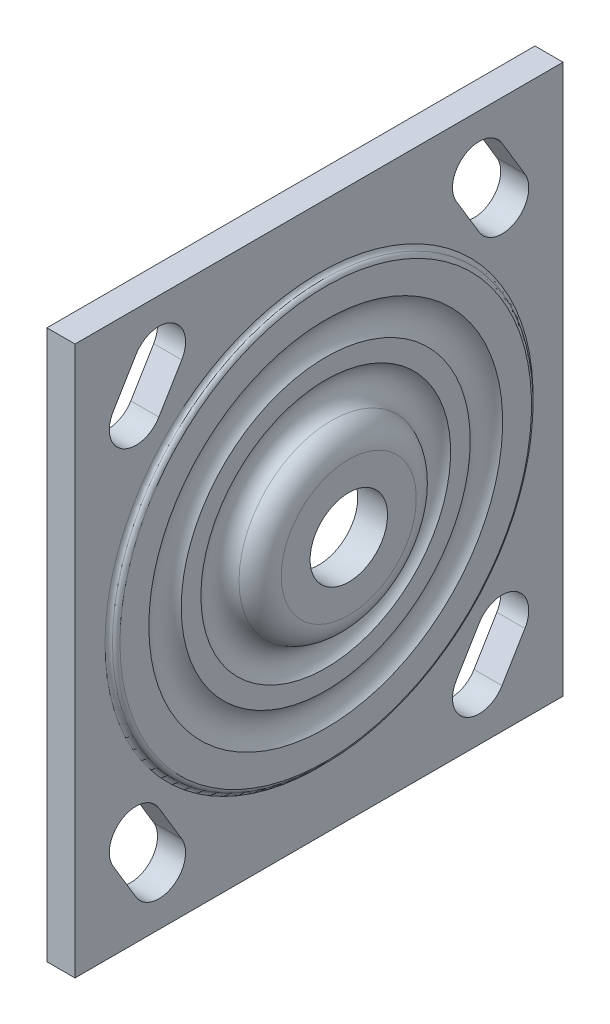
ISO-10303-21;
HEADER;
FILE_DESCRIPTION(('STEP AP214'),'2;1');
FILE_NAME('part.step','',(''),(''),'','','');
FILE_SCHEMA(('AUTOMOTIVE_DESIGN { 1 0 10303 214 1 1 1 1 }'));
ENDSEC;
DATA;
#1=APPLICATION_CONTEXT('core data for automotive mechanical design processes');
#2=APPLICATION_PROTOCOL_DEFINITION('international standard','automotive_design',2000,#1);
#3=PRODUCT_CONTEXT('',#1,'mechanical');
#4=PRODUCT('Part','Part','',(#3));
#5=PRODUCT_RELATED_PRODUCT_CATEGORY('part','',(#4));
#6=PRODUCT_DEFINITION_FORMATION('','',#4);
#7=PRODUCT_DEFINITION_CONTEXT('part definition',#1,'design');
#8=PRODUCT_DEFINITION('design','',#6,#7);
#9=PRODUCT_DEFINITION_SHAPE('','',#8);
#10=(LENGTH_UNIT() NAMED_UNIT(*) SI_UNIT(.MILLI.,.METRE.));
#11=(NAMED_UNIT(*) PLANE_ANGLE_UNIT() SI_UNIT($,.RADIAN.));
#12=(NAMED_UNIT(*) SI_UNIT($,.STERADIAN.) SOLID_ANGLE_UNIT());
#13=UNCERTAINTY_MEASURE_WITH_UNIT(LENGTH_MEASURE(1.E-05),#10,'distance_accuracy_value','');
#14=(GEOMETRIC_REPRESENTATION_CONTEXT(3) GLOBAL_UNCERTAINTY_ASSIGNED_CONTEXT((#13)) GLOBAL_UNIT_ASSIGNED_CONTEXT((#10,
#11,#12)) REPRESENTATION_CONTEXT('',''));
#15=CARTESIAN_POINT('',(0.,0.,0.));
#16=DIRECTION('',(0.,0.,1.));
#17=DIRECTION('',(1.,0.,0.));
#18=AXIS2_PLACEMENT_3D('',#15,#16,#17);
#19=CARTESIAN_POINT('',(-9.34719999999996,0.,0.));
#20=DIRECTION('',(-1.,0.,0.));
#21=DIRECTION('',(0.,0.,1.));
#22=AXIS2_PLACEMENT_3D('',#19,#20,#21);
#23=TOROIDAL_SURFACE('',#22,40.41507152324,4.77520000000001);
#24=CARTESIAN_POINT('',(-5.84199999999992,0.,0.));
#25=DIRECTION('',(-1.,0.,0.));
#26=DIRECTION('',(0.,0.,1.));
#27=AXIS2_PLACEMENT_3D('',#24,#25,#26);
#28=CIRCLE('',#27,37.1722166081999);
#29=CARTESIAN_POINT('',(-5.84199999999992,0.,37.1722166081999));
#30=VERTEX_POINT('',#29);
#31=EDGE_CURVE('E345',#30,#30,#28,.T.);
#32=ORIENTED_EDGE('',*,*,#31,.F.);
#33=EDGE_LOOP('',(#32));
#34=FACE_BOUND('',#33,.T.);
#35=CARTESIAN_POINT('',(-5.84199999999991,0.,0.));
#36=DIRECTION('',(-1.,0.,0.));
#37=DIRECTION('',(0.,0.,1.));
#38=AXIS2_PLACEMENT_3D('',#35,#36,#37);
#39=CIRCLE('',#38,43.6579264382801);
#40=CARTESIAN_POINT('',(-5.84199999999991,0.,43.6579264382801));
#41=VERTEX_POINT('',#40);
#42=EDGE_CURVE('E296',#41,#41,#39,.T.);
#43=ORIENTED_EDGE('',*,*,#42,.T.);
#44=EDGE_LOOP('',(#43));
#45=FACE_BOUND('',#44,.T.);
#46=ADVANCED_FACE('F17',(#34,#45),#23,.F.);
#47=CARTESIAN_POINT('',(-5.84199999999992,37.1722166081999,0.));
#48=DIRECTION('',(1.,0.,0.));
#49=DIRECTION('',(0.,0.,-1.));
#50=AXIS2_PLACEMENT_3D('',#47,#48,#49);
#51=PLANE('',#50);
#52=CARTESIAN_POINT('',(-5.84199999999992,0.,0.));
#53=DIRECTION('',(-1.,0.,0.));
#54=DIRECTION('',(0.,0.,1.));
#55=AXIS2_PLACEMENT_3D('',#52,#53,#54);
#56=CIRCLE('',#55,30.7415299150416);
#57=CARTESIAN_POINT('',(-5.84199999999992,0.,30.7415299150416));
#58=VERTEX_POINT('',#57);
#59=EDGE_CURVE('E342',#58,#58,#56,.T.);
#60=ORIENTED_EDGE('',*,*,#59,.F.);
#61=EDGE_LOOP('',(#60));
#62=FACE_BOUND('',#61,.T.);
#63=ORIENTED_EDGE('',*,*,#31,.T.);
#64=EDGE_LOOP('',(#63));
#65=FACE_BOUND('',#64,.T.);
#66=ADVANCED_FACE('F380',(#62,#65),#51,.F.);
#67=CARTESIAN_POINT('',(-9.34720000000001,0.,0.));
#68=DIRECTION('',(-1.,0.,0.));
#69=DIRECTION('',(0.,0.,1.));
#70=AXIS2_PLACEMENT_3D('',#67,#68,#69);
#71=TOROIDAL_SURFACE('',#70,27.4986750000015,4.77520000000003);
#72=CARTESIAN_POINT('',(-5.84200000000001,0.,0.));
#73=DIRECTION('',(-1.,0.,0.));
#74=DIRECTION('',(0.,0.,1.));
#75=AXIS2_PLACEMENT_3D('',#72,#73,#74);
#76=CIRCLE('',#75,24.2558200849613);
#77=CARTESIAN_POINT('',(-5.84200000000001,0.,24.2558200849613));
#78=VERTEX_POINT('',#77);
#79=EDGE_CURVE('E339',#78,#78,#76,.T.);
#80=ORIENTED_EDGE('',*,*,#79,.F.);
#81=EDGE_LOOP('',(#80));
#82=FACE_BOUND('',#81,.T.);
#83=ORIENTED_EDGE('',*,*,#59,.T.);
#84=EDGE_LOOP('',(#83));
#85=FACE_BOUND('',#84,.T.);
#86=ADVANCED_FACE('F386',(#82,#85),#71,.F.);
#87=CARTESIAN_POINT('',(-5.84200000000001,24.2558200849613,0.));
#88=DIRECTION('',(1.,0.,0.));
#89=DIRECTION('',(0.,0.,-1.));
#90=AXIS2_PLACEMENT_3D('',#87,#88,#89);
#91=PLANE('',#90);
#92=CARTESIAN_POINT('',(-5.84200000000001,0.,0.));
#93=DIRECTION('',(-1.,0.,0.));
#94=DIRECTION('',(0.,0.,1.));
#95=AXIS2_PLACEMENT_3D('',#92,#93,#94);
#96=CIRCLE('',#95,19.4416968589855);
#97=CARTESIAN_POINT('',(-5.84200000000001,0.,19.4416968589855));
#98=VERTEX_POINT('',#97);
#99=EDGE_CURVE('E336',#98,#98,#96,.T.);
#100=ORIENTED_EDGE('',*,*,#99,.F.);
#101=EDGE_LOOP('',(#100));
#102=FACE_BOUND('',#101,.T.);
#103=ORIENTED_EDGE('',*,*,#79,.T.);
#104=EDGE_LOOP('',(#103));
#105=FACE_BOUND('',#104,.T.);
#106=ADVANCED_FACE('F450',(#102,#105),#91,.F.);
#107=CARTESIAN_POINT('',(-0.285749999999976,0.,0.));
#108=DIRECTION('',(-1.,0.,0.));
#109=DIRECTION('',(0.,0.,1.));
#110=AXIS2_PLACEMENT_3D('',#107,#108,#109);
#111=TOROIDAL_SURFACE('',#110,19.4416968589853,5.55625000000003);
#112=CARTESIAN_POINT('',(-1.29822222222226,0.,0.));
#113=DIRECTION('',(-1.,0.,0.));
#114=DIRECTION('',(0.,0.,1.));
#115=AXIS2_PLACEMENT_3D('',#112,#113,#114);
#116=CIRCLE('',#115,13.978473079775);
#117=CARTESIAN_POINT('',(-1.29822222222226,0.,13.978473079775));
#118=VERTEX_POINT('',#117);
#119=EDGE_CURVE('E333',#118,#118,#116,.T.);
#120=ORIENTED_EDGE('',*,*,#119,.F.);
#121=EDGE_LOOP('',(#120));
#122=FACE_BOUND('',#121,.T.);
#123=ORIENTED_EDGE('',*,*,#99,.T.);
#124=EDGE_LOOP('',(#123));
#125=FACE_BOUND('',#124,.T.);
#126=ADVANCED_FACE('F446',(#122,#125),#111,.T.);
#127=CARTESIAN_POINT('',(-1.58750000000007,0.,0.));
#128=DIRECTION('',(-1.,0.,0.));
#129=DIRECTION('',(0.,0.,1.));
#130=AXIS2_PLACEMENT_3D('',#127,#128,#129);
#131=TOROIDAL_SURFACE('',#130,12.4175520000009,1.58749999999973);
#132=CARTESIAN_POINT('',(-3.40222641725951E-13,0.,0.));
#133=DIRECTION('',(-1.,0.,0.));
#134=DIRECTION('',(0.,0.,1.));
#135=AXIS2_PLACEMENT_3D('',#132,#133,#134);
#136=CIRCLE('',#135,12.417552);
#137=CARTESIAN_POINT('',(-3.40222641725951E-13,0.,12.417552));
#138=VERTEX_POINT('',#137);
#139=EDGE_CURVE('E330',#138,#138,#136,.T.);
#140=ORIENTED_EDGE('',*,*,#139,.F.);
#141=EDGE_LOOP('',(#140));
#142=FACE_BOUND('',#141,.T.);
#143=ORIENTED_EDGE('',*,*,#119,.T.);
#144=EDGE_LOOP('',(#143));
#145=FACE_BOUND('',#144,.T.);
#146=ADVANCED_FACE('F442',(#142,#145),#131,.F.);
#147=CARTESIAN_POINT('',(-3.39146535884689E-13,12.417552,0.));
#148=DIRECTION('',(1.,0.,0.));
#149=DIRECTION('',(0.,0.,-1.));
#150=AXIS2_PLACEMENT_3D('',#147,#148,#149);
#151=PLANE('',#150);
#152=CARTESIAN_POINT('',(-3.38070430043429E-13,0.,0.));
#153=DIRECTION('',(-1.,0.,0.));
#154=DIRECTION('',(0.,0.,1.));
#155=AXIS2_PLACEMENT_3D('',#152,#153,#154);
#156=CIRCLE('',#155,8.0645);
#157=CARTESIAN_POINT('',(-3.38070430043429E-13,0.,8.0645));
#158=VERTEX_POINT('',#157);
#159=EDGE_CURVE('E327',#158,#158,#156,.T.);
#160=ORIENTED_EDGE('',*,*,#159,.F.);
#161=EDGE_LOOP('',(#160));
#162=FACE_BOUND('',#161,.T.);
#163=ORIENTED_EDGE('',*,*,#139,.T.);
#164=EDGE_LOOP('',(#163));
#165=FACE_BOUND('',#164,.T.);
#166=ADVANCED_FACE('F438',(#162,#165),#151,.F.);
#167=CARTESIAN_POINT('',(6.27954986710278E-11,0.,0.));
#168=DIRECTION('',(-1.,0.,0.));
#169=DIRECTION('',(0.,0.,1.));
#170=AXIS2_PLACEMENT_3D('',#167,#168,#169);
#171=CYLINDRICAL_SURFACE('',#170,8.0645);
#172=CARTESIAN_POINT('',(6.19759999999961,0.,0.));
#173=DIRECTION('',(-1.,0.,0.));
#174=DIRECTION('',(0.,0.,1.));
#175=AXIS2_PLACEMENT_3D('',#172,#173,#174);
#176=CIRCLE('',#175,8.0645);
#177=CARTESIAN_POINT('',(6.19759999999961,0.,8.0645));
#178=VERTEX_POINT('',#177);
#179=EDGE_CURVE('E324',#178,#178,#176,.T.);
#180=ORIENTED_EDGE('',*,*,#179,.F.);
#181=EDGE_LOOP('',(#180));
#182=FACE_BOUND('',#181,.T.);
#183=ORIENTED_EDGE('',*,*,#159,.T.);
#184=EDGE_LOOP('',(#183));
#185=FACE_BOUND('',#184,.T.);
#186=ADVANCED_FACE('F434',(#182,#185),#171,.F.);
#187=CARTESIAN_POINT('',(6.19759999999961,14.0562775598835,0.));
#188=DIRECTION('',(-1.,0.,0.));
#189=DIRECTION('',(0.,0.,1.));
#190=AXIS2_PLACEMENT_3D('',#187,#188,#189);
#191=PLANE('',#190);
#192=CARTESIAN_POINT('',(6.19759999999961,0.,0.));
#193=DIRECTION('',(-1.,0.,0.));
#194=DIRECTION('',(0.,0.,1.));
#195=AXIS2_PLACEMENT_3D('',#192,#193,#194);
#196=CIRCLE('',#195,14.0562775598835);
#197=CARTESIAN_POINT('',(6.19759999999961,0.,14.0562775598835));
#198=VERTEX_POINT('',#197);
#199=EDGE_CURVE('E321',#198,#198,#196,.T.);
#200=ORIENTED_EDGE('',*,*,#199,.F.);
#201=EDGE_LOOP('',(#200));
#202=FACE_BOUND('',#201,.T.);
#203=ORIENTED_EDGE('',*,*,#179,.T.);
#204=EDGE_LOOP('',(#203));
#205=FACE_BOUND('',#204,.T.);
#206=ADVANCED_FACE('F430',(#202,#205),#191,.F.);
#207=CARTESIAN_POINT('',(0.660399999999837,0.,0.));
#208=DIRECTION('',(-1.,0.,0.));
#209=DIRECTION('',(0.,0.,1.));
#210=AXIS2_PLACEMENT_3D('',#207,#208,#209);
#211=TOROIDAL_SURFACE('',#210,14.0562775598829,5.53719999999977);
#212=CARTESIAN_POINT('',(2.58750835003288,0.,0.));
#213=DIRECTION('',(-1.,0.,0.));
#214=DIRECTION('',(0.,0.,1.));
#215=AXIS2_PLACEMENT_3D('',#212,#213,#214);
#216=CIRCLE('',#215,19.2473118737004);
#217=CARTESIAN_POINT('',(2.58750835003288,0.,19.2473118737004));
#218=VERTEX_POINT('',#217);
#219=EDGE_CURVE('E318',#218,#218,#216,.T.);
#220=ORIENTED_EDGE('',*,*,#219,.F.);
#221=EDGE_LOOP('',(#220));
#222=FACE_BOUND('',#221,.T.);
#223=ORIENTED_EDGE('',*,*,#199,.T.);
#224=EDGE_LOOP('',(#223));
#225=FACE_BOUND('',#224,.T.);
#226=ADVANCED_FACE('F426',(#222,#225),#211,.T.);
#227=CARTESIAN_POINT('',(3.96874999999949,0.,0.));
#228=DIRECTION('',(-1.,0.,0.));
#229=DIRECTION('',(0.,0.,1.));
#230=AXIS2_PLACEMENT_3D('',#227,#228,#229);
#231=TOROIDAL_SURFACE('',#230,22.9679500000031,3.96875);
#232=CARTESIAN_POINT('',(1.39699999999934,0.,0.));
#233=DIRECTION('',(-1.,0.,0.));
#234=DIRECTION('',(0.,0.,1.));
#235=AXIS2_PLACEMENT_3D('',#232,#233,#234);
#236=CIRCLE('',#235,25.9907100797976);
#237=CARTESIAN_POINT('',(1.39699999999934,0.,25.9907100797976));
#238=VERTEX_POINT('',#237);
#239=EDGE_CURVE('E315',#238,#238,#236,.T.);
#240=ORIENTED_EDGE('',*,*,#239,.F.);
#241=EDGE_LOOP('',(#240));
#242=FACE_BOUND('',#241,.T.);
#243=ORIENTED_EDGE('',*,*,#219,.T.);
#244=EDGE_LOOP('',(#243));
#245=FACE_BOUND('',#244,.T.);
#246=ADVANCED_FACE('F422',(#242,#245),#231,.F.);
#247=CARTESIAN_POINT('',(1.39699999999934,30.0768481781234,0.));
#248=DIRECTION('',(-1.,0.,0.));
#249=DIRECTION('',(0.,0.,1.));
#250=AXIS2_PLACEMENT_3D('',#247,#248,#249);
#251=PLANE('',#250);
#252=CARTESIAN_POINT('',(1.39699999999934,0.,0.));
#253=DIRECTION('',(-1.,0.,0.));
#254=DIRECTION('',(0.,0.,1.));
#255=AXIS2_PLACEMENT_3D('',#252,#253,#254);
#256=CIRCLE('',#255,30.0768481781234);
#257=CARTESIAN_POINT('',(1.39699999999934,0.,30.0768481781234));
#258=VERTEX_POINT('',#257);
#259=EDGE_CURVE('E312',#258,#258,#256,.T.);
#260=ORIENTED_EDGE('',*,*,#259,.F.);
#261=EDGE_LOOP('',(#260));
#262=FACE_BOUND('',#261,.T.);
#263=ORIENTED_EDGE('',*,*,#239,.T.);
#264=EDGE_LOOP('',(#263));
#265=FACE_BOUND('',#264,.T.);
#266=ADVANCED_FACE('F418',(#262,#265),#251,.F.);
#267=CARTESIAN_POINT('',(4.7751999999997,0.,0.));
#268=DIRECTION('',(-1.,0.,0.));
#269=DIRECTION('',(0.,0.,1.));
#270=AXIS2_PLACEMENT_3D('',#267,#268,#269);
#271=TOROIDAL_SURFACE('',#270,33.4518000000013,4.77519999999998);
#272=CARTESIAN_POINT('',(1.39700000000004,0.,0.));
#273=DIRECTION('',(-1.,0.,0.));
#274=DIRECTION('',(0.,0.,1.));
#275=AXIS2_PLACEMENT_3D('',#272,#273,#274);
#276=CIRCLE('',#275,36.82675182188);
#277=CARTESIAN_POINT('',(1.39700000000004,0.,36.82675182188));
#278=VERTEX_POINT('',#277);
#279=EDGE_CURVE('E309',#278,#278,#276,.T.);
#280=ORIENTED_EDGE('',*,*,#279,.F.);
#281=EDGE_LOOP('',(#280));
#282=FACE_BOUND('',#281,.T.);
#283=ORIENTED_EDGE('',*,*,#259,.T.);
#284=EDGE_LOOP('',(#283));
#285=FACE_BOUND('',#284,.T.);
#286=ADVANCED_FACE('F414',(#282,#285),#271,.F.);
#287=CARTESIAN_POINT('',(1.39700000000004,42.8341143452214,0.));
#288=DIRECTION('',(-1.,0.,0.));
#289=DIRECTION('',(0.,0.,1.));
#290=AXIS2_PLACEMENT_3D('',#287,#288,#289);
#291=PLANE('',#290);
#292=CARTESIAN_POINT('',(1.39700000000004,0.,0.));
#293=DIRECTION('',(-1.,0.,0.));
#294=DIRECTION('',(0.,0.,1.));
#295=AXIS2_PLACEMENT_3D('',#292,#293,#294);
#296=CIRCLE('',#295,42.8341143452214);
#297=CARTESIAN_POINT('',(1.39700000000004,0.,42.8341143452214));
#298=VERTEX_POINT('',#297);
#299=EDGE_CURVE('E306',#298,#298,#296,.T.);
#300=ORIENTED_EDGE('',*,*,#299,.F.);
#301=EDGE_LOOP('',(#300));
#302=FACE_BOUND('',#301,.T.);
#303=ORIENTED_EDGE('',*,*,#279,.T.);
#304=EDGE_LOOP('',(#303));
#305=FACE_BOUND('',#304,.T.);
#306=ADVANCED_FACE('F410',(#302,#305),#291,.F.);
#307=CARTESIAN_POINT('',(0.298557634848601,0.,0.));
#308=DIRECTION('',(-1.,0.,0.));
#309=DIRECTION('',(0.,0.,1.));
#310=AXIS2_PLACEMENT_3D('',#307,#308,#309);
#311=TOROIDAL_SURFACE('',#310,42.661742014373,1.11188481867575);
#312=CARTESIAN_POINT('',(0.698499999999996,0.,0.));
#313=DIRECTION('',(-1.,0.,0.));
#314=DIRECTION('',(0.,0.,1.));
#315=AXIS2_PLACEMENT_3D('',#312,#313,#314);
#316=CIRCLE('',#315,43.6992071726115);
#317=CARTESIAN_POINT('',(0.698499999999996,0.,43.6992071726115));
#318=VERTEX_POINT('',#317);
#319=EDGE_CURVE('E303',#318,#318,#316,.T.);
#320=ORIENTED_EDGE('',*,*,#319,.F.);
#321=EDGE_LOOP('',(#320));
#322=FACE_BOUND('',#321,.T.);
#323=ORIENTED_EDGE('',*,*,#299,.T.);
#324=EDGE_LOOP('',(#323));
#325=FACE_BOUND('',#324,.T.);
#326=ADVANCED_FACE('F406',(#322,#325),#311,.T.);
#327=CARTESIAN_POINT('',(1.0984423651515,0.,0.));
#328=DIRECTION('',(-1.,0.,0.));
#329=DIRECTION('',(0.,0.,1.));
#330=AXIS2_PLACEMENT_3D('',#327,#328,#329);
#331=TOROIDAL_SURFACE('',#330,44.7366723308499,1.11188481867575);
#332=CARTESIAN_POINT('',(0.,0.,0.));
#333=DIRECTION('',(-1.,0.,0.));
#334=DIRECTION('',(0.,0.,1.));
#335=AXIS2_PLACEMENT_3D('',#332,#333,#334);
#336=CIRCLE('',#335,44.5643000000015);
#337=CARTESIAN_POINT('',(0.,0.,44.5643000000015));
#338=VERTEX_POINT('',#337);
#339=EDGE_CURVE('E300',#338,#338,#336,.T.);
#340=ORIENTED_EDGE('',*,*,#339,.F.);
#341=EDGE_LOOP('',(#340));
#342=FACE_BOUND('',#341,.T.);
#343=ORIENTED_EDGE('',*,*,#319,.T.);
#344=EDGE_LOOP('',(#343));
#345=FACE_BOUND('',#344,.T.);
#346=ADVANCED_FACE('F400',(#342,#345),#331,.F.);
#347=CARTESIAN_POINT('',(0.,80.9625,0.));
#348=DIRECTION('',(-1.,0.,0.));
#349=DIRECTION('',(0.,0.,1.));
#350=AXIS2_PLACEMENT_3D('',#347,#348,#349);
#351=PLANE('',#350);
#352=DIRECTION('',(0.,0.857492925712545,-0.514495755427525));
#353=VECTOR('',#352,1.);
#354=CARTESIAN_POINT('',(0.,43.1788329589059,28.5730549315097));
#355=LINE('',#354,#353);
#356=CARTESIAN_POINT('',(0.,35.2413329589058,33.3355549315097));
#357=VERTEX_POINT('',#356);
#358=CARTESIAN_POINT('',(0.,43.1788329589058,28.5730549315096));
#359=VERTEX_POINT('',#358);
#360=EDGE_CURVE('E734',#357,#359,#355,.T.);
#361=ORIENTED_EDGE('',*,*,#360,.F.);
#362=CARTESIAN_POINT('',(0.,38.1,38.1));
#363=DIRECTION('',(-1.,0.,0.));
#364=DIRECTION('',(0.,0.,1.));
#365=AXIS2_PLACEMENT_3D('',#362,#363,#364);
#366=CIRCLE('',#365,5.55625000000002);
#367=CARTESIAN_POINT('',(0.,40.9586670410942,42.8644450684904));
#368=VERTEX_POINT('',#367);
#369=EDGE_CURVE('E184',#368,#357,#366,.F.);
#370=ORIENTED_EDGE('',*,*,#369,.F.);
#371=DIRECTION('',(0.,-0.857492925712545,0.514495755427525));
#372=VECTOR('',#371,1.);
#373=CARTESIAN_POINT('',(0.,48.8961670410942,38.1019450684904));
#374=LINE('',#373,#372);
#375=CARTESIAN_POINT('',(0.,48.8961670410942,38.1019450684904));
#376=VERTEX_POINT('',#375);
#377=EDGE_CURVE('E181',#376,#368,#374,.T.);
#378=ORIENTED_EDGE('',*,*,#377,.F.);
#379=CARTESIAN_POINT('',(0.,46.0375,33.3375));
#380=DIRECTION('',(-1.,0.,0.));
#381=DIRECTION('',(0.,0.,1.));
#382=AXIS2_PLACEMENT_3D('',#379,#380,#381);
#383=CIRCLE('',#382,5.55625000000002);
#384=EDGE_CURVE('E159',#359,#376,#383,.F.);
#385=ORIENTED_EDGE('',*,*,#384,.F.);
#386=EDGE_LOOP('',(#361,#370,#378,#385));
#387=FACE_BOUND('',#386,.T.);
#388=DIRECTION('',(0.,0.857492925712544,0.514495755427527));
#389=VECTOR('',#388,1.);
#390=CARTESIAN_POINT('',(0.,-43.1788329589058,28.5730549315096));
#391=LINE('',#390,#389);
#392=CARTESIAN_POINT('',(0.,-43.1788329589058,28.5730549315096));
#393=VERTEX_POINT('',#392);
#394=CARTESIAN_POINT('',(0.,-35.2413329589058,33.3355549315096));
#395=VERTEX_POINT('',#394);
#396=EDGE_CURVE('E188',#393,#395,#391,.T.);
#397=ORIENTED_EDGE('',*,*,#396,.F.);
#398=CARTESIAN_POINT('',(0.,-46.0375,33.3374999999999));
#399=DIRECTION('',(-1.,0.,0.));
#400=DIRECTION('',(0.,0.,1.));
#401=AXIS2_PLACEMENT_3D('',#398,#399,#400);
#402=CIRCLE('',#401,5.55625000000001);
#403=CARTESIAN_POINT('',(0.,-48.8961670410942,38.1019450684902));
#404=VERTEX_POINT('',#403);
#405=EDGE_CURVE('E191',#404,#393,#402,.F.);
#406=ORIENTED_EDGE('',*,*,#405,.F.);
#407=DIRECTION('',(0.,-0.857492925712544,-0.514495755427527));
#408=VECTOR('',#407,1.);
#409=CARTESIAN_POINT('',(0.,-48.8961670410942,38.1019450684902));
#410=LINE('',#409,#408);
#411=CARTESIAN_POINT('',(0.,-40.9586670410942,42.8644450684902));
#412=VERTEX_POINT('',#411);
#413=EDGE_CURVE('E193',#412,#404,#410,.T.);
#414=ORIENTED_EDGE('',*,*,#413,.F.);
#415=CARTESIAN_POINT('',(0.,-38.1,38.0999999999999));
#416=DIRECTION('',(-1.,0.,0.));
#417=DIRECTION('',(0.,0.,1.));
#418=AXIS2_PLACEMENT_3D('',#415,#416,#417);
#419=CIRCLE('',#418,5.55625000000001);
#420=EDGE_CURVE('E185',#395,#412,#419,.F.);
#421=ORIENTED_EDGE('',*,*,#420,.F.);
#422=EDGE_LOOP('',(#397,#406,#414,#421));
#423=FACE_BOUND('',#422,.T.);
#424=DIRECTION('',(0.,-0.857492925712543,0.514495755427528));
#425=VECTOR('',#424,1.);
#426=CARTESIAN_POINT('',(0.,-35.2413329589058,-33.3355549315098));
#427=LINE('',#426,#425);
#428=CARTESIAN_POINT('',(0.,-35.2413329589058,-33.3355549315098));
#429=VERTEX_POINT('',#428);
#430=CARTESIAN_POINT('',(0.,-43.1788329589058,-28.5730549315097));
#431=VERTEX_POINT('',#430);
#432=EDGE_CURVE('E217',#429,#431,#427,.T.);
#433=ORIENTED_EDGE('',*,*,#432,.F.);
#434=CARTESIAN_POINT('',(0.,-38.1,-38.1000000000001));
#435=DIRECTION('',(-1.,0.,0.));
#436=DIRECTION('',(0.,0.,1.));
#437=AXIS2_PLACEMENT_3D('',#434,#435,#436);
#438=CIRCLE('',#437,5.55625000000001);
#439=CARTESIAN_POINT('',(0.,-40.9586670410942,-42.8644450684904));
#440=VERTEX_POINT('',#439);
#441=EDGE_CURVE('E220',#440,#429,#438,.F.);
#442=ORIENTED_EDGE('',*,*,#441,.F.);
#443=DIRECTION('',(0.,0.857492925712544,-0.514495755427527));
#444=VECTOR('',#443,1.);
#445=CARTESIAN_POINT('',(0.,-40.9586670410942,-42.8644450684904));
#446=LINE('',#445,#444);
#447=CARTESIAN_POINT('',(0.,-48.8961670410942,-38.1019450684904));
#448=VERTEX_POINT('',#447);
#449=EDGE_CURVE('E222',#448,#440,#446,.T.);
#450=ORIENTED_EDGE('',*,*,#449,.F.);
#451=CARTESIAN_POINT('',(0.,-46.0375,-33.3375000000001));
#452=DIRECTION('',(-1.,0.,0.));
#453=DIRECTION('',(0.,0.,1.));
#454=AXIS2_PLACEMENT_3D('',#451,#452,#453);
#455=CIRCLE('',#454,5.55625000000002);
#456=EDGE_CURVE('E214',#431,#448,#455,.F.);
#457=ORIENTED_EDGE('',*,*,#456,.F.);
#458=EDGE_LOOP('',(#433,#442,#450,#457));
#459=FACE_BOUND('',#458,.T.);
#460=DIRECTION('',(0.,0.857492925712543,0.514495755427529));
#461=VECTOR('',#460,1.);
#462=CARTESIAN_POINT('',(0.,40.9586670410942,-42.8644450684904));
#463=LINE('',#462,#461);
#464=CARTESIAN_POINT('',(0.,40.9586670410942,-42.8644450684904));
#465=VERTEX_POINT('',#464);
#466=CARTESIAN_POINT('',(0.,48.8961670410943,-38.1019450684903));
#467=VERTEX_POINT('',#466);
#468=EDGE_CURVE('E246',#465,#467,#463,.T.);
#469=ORIENTED_EDGE('',*,*,#468,.F.);
#470=CARTESIAN_POINT('',(0.,38.1,-38.1000000000001));
#471=DIRECTION('',(-1.,0.,0.));
#472=DIRECTION('',(0.,0.,1.));
#473=AXIS2_PLACEMENT_3D('',#470,#471,#472);
#474=CIRCLE('',#473,5.55625000000001);
#475=CARTESIAN_POINT('',(0.,35.2413329589058,-33.3355549315097));
#476=VERTEX_POINT('',#475);
#477=EDGE_CURVE('E249',#476,#465,#474,.F.);
#478=ORIENTED_EDGE('',*,*,#477,.F.);
#479=DIRECTION('',(0.,-0.857492925712545,-0.514495755427525));
#480=VECTOR('',#479,1.);
#481=CARTESIAN_POINT('',(0.,35.2413329589058,-33.3355549315097));
#482=LINE('',#481,#480);
#483=CARTESIAN_POINT('',(0.,43.1788329589059,-28.5730549315097));
#484=VERTEX_POINT('',#483);
#485=EDGE_CURVE('E251',#484,#476,#482,.T.);
#486=ORIENTED_EDGE('',*,*,#485,.F.);
#487=CARTESIAN_POINT('',(0.,46.0375,-33.3375));
#488=DIRECTION('',(-1.,0.,0.));
#489=DIRECTION('',(0.,0.,1.));
#490=AXIS2_PLACEMENT_3D('',#487,#488,#489);
#491=CIRCLE('',#490,5.55624999999998);
#492=EDGE_CURVE('E243',#467,#484,#491,.F.);
#493=ORIENTED_EDGE('',*,*,#492,.F.);
#494=EDGE_LOOP('',(#469,#478,#486,#493));
#495=FACE_BOUND('',#494,.T.);
#496=DIRECTION('',(0.,1.,0.));
#497=VECTOR('',#496,1.);
#498=CARTESIAN_POINT('',(0.,80.9625,50.8));
#499=LINE('',#498,#497);
#500=CARTESIAN_POINT('',(0.,-57.15,50.8));
#501=VERTEX_POINT('',#500);
#502=CARTESIAN_POINT('',(0.,57.15,50.8));
#503=VERTEX_POINT('',#502);
#504=EDGE_CURVE('E290',#501,#503,#499,.T.);
#505=ORIENTED_EDGE('',*,*,#504,.F.);
#506=DIRECTION('',(0.,0.,-1.));
#507=VECTOR('',#506,1.);
#508=CARTESIAN_POINT('',(0.,-57.15,0.));
#509=LINE('',#508,#507);
#510=CARTESIAN_POINT('',(0.,-57.15,-50.8));
#511=VERTEX_POINT('',#510);
#512=EDGE_CURVE('E276',#501,#511,#509,.T.);
#513=ORIENTED_EDGE('',*,*,#512,.T.);
#514=DIRECTION('',(0.,-1.,0.));
#515=VECTOR('',#514,1.);
#516=CARTESIAN_POINT('',(0.,80.9625,-50.8));
#517=LINE('',#516,#515);
#518=CARTESIAN_POINT('',(0.,57.15,-50.8));
#519=VERTEX_POINT('',#518);
#520=EDGE_CURVE('E293',#519,#511,#517,.T.);
#521=ORIENTED_EDGE('',*,*,#520,.F.);
#522=DIRECTION('',(0.,0.,1.));
#523=VECTOR('',#522,1.);
#524=CARTESIAN_POINT('',(0.,57.15,0.));
#525=LINE('',#524,#523);
#526=EDGE_CURVE('E284',#519,#503,#525,.T.);
#527=ORIENTED_EDGE('',*,*,#526,.T.);
#528=EDGE_LOOP('',(#505,#513,#521,#527));
#529=FACE_BOUND('',#528,.T.);
#530=ORIENTED_EDGE('',*,*,#339,.T.);
#531=EDGE_LOOP('',(#530));
#532=FACE_BOUND('',#531,.T.);
#533=ADVANCED_FACE('F365',(#387,#423,#459,#495,#529,#532),#351,.F.);
#534=CARTESIAN_POINT('',(-5.84199999999991,80.9625,0.));
#535=DIRECTION('',(1.,0.,0.));
#536=DIRECTION('',(0.,0.,-1.));
#537=AXIS2_PLACEMENT_3D('',#534,#535,#536);
#538=PLANE('',#537);
#539=DIRECTION('',(0.,0.857492925712545,-0.514495755427525));
#540=VECTOR('',#539,1.);
#541=CARTESIAN_POINT('',(-5.84199999999991,48.8961670410942,38.1019450684904));
#542=LINE('',#541,#540);
#543=CARTESIAN_POINT('',(-5.84199999999991,40.9586670410942,42.8644450684904));
#544=VERTEX_POINT('',#543);
#545=CARTESIAN_POINT('',(-5.84199999999991,48.8961670410942,38.1019450684903));
#546=VERTEX_POINT('',#545);
#547=EDGE_CURVE('E165',#544,#546,#542,.T.);
#548=ORIENTED_EDGE('',*,*,#547,.F.);
#549=CARTESIAN_POINT('',(-5.84199999999991,38.1,38.1));
#550=DIRECTION('',(-1.,0.,0.));
#551=DIRECTION('',(0.,0.,1.));
#552=AXIS2_PLACEMENT_3D('',#549,#550,#551);
#553=CIRCLE('',#552,5.55625000000002);
#554=CARTESIAN_POINT('',(-5.84199999999991,35.2413329589058,33.3355549315097));
#555=VERTEX_POINT('',#554);
#556=EDGE_CURVE('E39',#555,#544,#553,.T.);
#557=ORIENTED_EDGE('',*,*,#556,.F.);
#558=DIRECTION('',(0.,-0.857492925712545,0.514495755427525));
#559=VECTOR('',#558,1.);
#560=CARTESIAN_POINT('',(-5.84199999999991,43.1788329589059,28.5730549315097));
#561=LINE('',#560,#559);
#562=CARTESIAN_POINT('',(-5.84199999999991,43.1788329589059,28.5730549315097));
#563=VERTEX_POINT('',#562);
#564=EDGE_CURVE('E172',#563,#555,#561,.T.);
#565=ORIENTED_EDGE('',*,*,#564,.F.);
#566=CARTESIAN_POINT('',(-5.84199999999991,46.0375,33.3375));
#567=DIRECTION('',(-1.,0.,0.));
#568=DIRECTION('',(0.,0.,1.));
#569=AXIS2_PLACEMENT_3D('',#566,#567,#568);
#570=CIRCLE('',#569,5.55625000000002);
#571=EDGE_CURVE('E156',#546,#563,#570,.T.);
#572=ORIENTED_EDGE('',*,*,#571,.F.);
#573=EDGE_LOOP('',(#548,#557,#565,#572));
#574=FACE_BOUND('',#573,.T.);
#575=DIRECTION('',(0.,0.857492925712544,0.514495755427527));
#576=VECTOR('',#575,1.);
#577=CARTESIAN_POINT('',(-5.84199999999991,-48.8961670410942,38.1019450684902));
#578=LINE('',#577,#576);
#579=CARTESIAN_POINT('',(-5.84199999999991,-48.8961670410942,38.1019450684902));
#580=VERTEX_POINT('',#579);
#581=CARTESIAN_POINT('',(-5.84199999999991,-40.9586670410942,42.8644450684902));
#582=VERTEX_POINT('',#581);
#583=EDGE_CURVE('E195',#580,#582,#578,.T.);
#584=ORIENTED_EDGE('',*,*,#583,.F.);
#585=CARTESIAN_POINT('',(-5.84199999999991,-46.0375,33.3374999999999));
#586=DIRECTION('',(-1.,0.,0.));
#587=DIRECTION('',(0.,0.,1.));
#588=AXIS2_PLACEMENT_3D('',#585,#586,#587);
#589=CIRCLE('',#588,5.55625000000001);
#590=CARTESIAN_POINT('',(-5.84199999999991,-43.1788329589058,28.5730549315096));
#591=VERTEX_POINT('',#590);
#592=EDGE_CURVE('E183',#591,#580,#589,.T.);
#593=ORIENTED_EDGE('',*,*,#592,.F.);
#594=DIRECTION('',(0.,-0.857492925712544,-0.514495755427527));
#595=VECTOR('',#594,1.);
#596=CARTESIAN_POINT('',(-5.84199999999991,-43.1788329589058,28.5730549315096));
#597=LINE('',#596,#595);
#598=CARTESIAN_POINT('',(-5.84199999999991,-35.2413329589058,33.3355549315096));
#599=VERTEX_POINT('',#598);
#600=EDGE_CURVE('E201',#599,#591,#597,.T.);
#601=ORIENTED_EDGE('',*,*,#600,.F.);
#602=CARTESIAN_POINT('',(-5.84199999999991,-38.1,38.0999999999999));
#603=DIRECTION('',(-1.,0.,0.));
#604=DIRECTION('',(0.,0.,1.));
#605=AXIS2_PLACEMENT_3D('',#602,#603,#604);
#606=CIRCLE('',#605,5.55625000000001);
#607=EDGE_CURVE('E198',#582,#599,#606,.T.);
#608=ORIENTED_EDGE('',*,*,#607,.F.);
#609=EDGE_LOOP('',(#584,#593,#601,#608));
#610=FACE_BOUND('',#609,.T.);
#611=DIRECTION('',(0.,-0.857492925712544,0.514495755427527));
#612=VECTOR('',#611,1.);
#613=CARTESIAN_POINT('',(-5.84199999999991,-40.9586670410942,-42.8644450684904));
#614=LINE('',#613,#612);
#615=CARTESIAN_POINT('',(-5.84199999999991,-40.9586670410942,-42.8644450684904));
#616=VERTEX_POINT('',#615);
#617=CARTESIAN_POINT('',(-5.84199999999991,-48.8961670410942,-38.1019450684904));
#618=VERTEX_POINT('',#617);
#619=EDGE_CURVE('E224',#616,#618,#614,.T.);
#620=ORIENTED_EDGE('',*,*,#619,.F.);
#621=CARTESIAN_POINT('',(-5.84199999999991,-38.1,-38.1000000000001));
#622=DIRECTION('',(-1.,0.,0.));
#623=DIRECTION('',(0.,0.,1.));
#624=AXIS2_PLACEMENT_3D('',#621,#622,#623);
#625=CIRCLE('',#624,5.55625000000001);
#626=CARTESIAN_POINT('',(-5.84199999999991,-35.2413329589058,-33.3355549315098));
#627=VERTEX_POINT('',#626);
#628=EDGE_CURVE('E213',#627,#616,#625,.T.);
#629=ORIENTED_EDGE('',*,*,#628,.F.);
#630=DIRECTION('',(0.,0.857492925712543,-0.514495755427528));
#631=VECTOR('',#630,1.);
#632=CARTESIAN_POINT('',(-5.84199999999991,-35.2413329589058,-33.3355549315098));
#633=LINE('',#632,#631);
#634=CARTESIAN_POINT('',(-5.84199999999991,-43.1788329589058,-28.5730549315097));
#635=VERTEX_POINT('',#634);
#636=EDGE_CURVE('E230',#635,#627,#633,.T.);
#637=ORIENTED_EDGE('',*,*,#636,.F.);
#638=CARTESIAN_POINT('',(-5.84199999999991,-46.0375,-33.3375000000001));
#639=DIRECTION('',(-1.,0.,0.));
#640=DIRECTION('',(0.,0.,1.));
#641=AXIS2_PLACEMENT_3D('',#638,#639,#640);
#642=CIRCLE('',#641,5.55625000000002);
#643=EDGE_CURVE('E227',#618,#635,#642,.T.);
#644=ORIENTED_EDGE('',*,*,#643,.F.);
#645=EDGE_LOOP('',(#620,#629,#637,#644));
#646=FACE_BOUND('',#645,.T.);
#647=DIRECTION('',(0.,0.857492925712545,0.514495755427525));
#648=VECTOR('',#647,1.);
#649=CARTESIAN_POINT('',(-5.84199999999991,35.2413329589058,-33.3355549315097));
#650=LINE('',#649,#648);
#651=CARTESIAN_POINT('',(-5.84199999999991,35.2413329589058,-33.3355549315097));
#652=VERTEX_POINT('',#651);
#653=CARTESIAN_POINT('',(-5.84199999999991,43.1788329589059,-28.5730549315097));
#654=VERTEX_POINT('',#653);
#655=EDGE_CURVE('E253',#652,#654,#650,.T.);
#656=ORIENTED_EDGE('',*,*,#655,.F.);
#657=CARTESIAN_POINT('',(-5.84199999999991,38.1,-38.1000000000001));
#658=DIRECTION('',(-1.,0.,0.));
#659=DIRECTION('',(0.,0.,1.));
#660=AXIS2_PLACEMENT_3D('',#657,#658,#659);
#661=CIRCLE('',#660,5.55625000000001);
#662=CARTESIAN_POINT('',(-5.84199999999991,40.9586670410942,-42.8644450684904));
#663=VERTEX_POINT('',#662);
#664=EDGE_CURVE('E242',#663,#652,#661,.T.);
#665=ORIENTED_EDGE('',*,*,#664,.F.);
#666=DIRECTION('',(0.,-0.857492925712543,-0.514495755427529));
#667=VECTOR('',#666,1.);
#668=CARTESIAN_POINT('',(-5.84199999999991,40.9586670410942,-42.8644450684904));
#669=LINE('',#668,#667);
#670=CARTESIAN_POINT('',(-5.84199999999991,48.8961670410943,-38.1019450684903));
#671=VERTEX_POINT('',#670);
#672=EDGE_CURVE('E259',#671,#663,#669,.T.);
#673=ORIENTED_EDGE('',*,*,#672,.F.);
#674=CARTESIAN_POINT('',(-5.84199999999991,46.0375,-33.3375));
#675=DIRECTION('',(-1.,0.,0.));
#676=DIRECTION('',(0.,0.,1.));
#677=AXIS2_PLACEMENT_3D('',#674,#675,#676);
#678=CIRCLE('',#677,5.55624999999998);
#679=EDGE_CURVE('E256',#654,#671,#678,.T.);
#680=ORIENTED_EDGE('',*,*,#679,.F.);
#681=EDGE_LOOP('',(#656,#665,#673,#680));
#682=FACE_BOUND('',#681,.T.);
#683=ORIENTED_EDGE('',*,*,#42,.F.);
#684=EDGE_LOOP('',(#683));
#685=FACE_BOUND('',#684,.T.);
#686=DIRECTION('',(0.,1.,0.));
#687=VECTOR('',#686,1.);
#688=CARTESIAN_POINT('',(-5.84199999999991,80.9625,-50.8));
#689=LINE('',#688,#687);
#690=CARTESIAN_POINT('',(-5.84199999999991,-57.15,-50.8));
#691=VERTEX_POINT('',#690);
#692=CARTESIAN_POINT('',(-5.84199999999991,57.15,-50.8));
#693=VERTEX_POINT('',#692);
#694=EDGE_CURVE('E292',#691,#693,#689,.T.);
#695=ORIENTED_EDGE('',*,*,#694,.F.);
#696=DIRECTION('',(0.,0.,-1.));
#697=VECTOR('',#696,1.);
#698=CARTESIAN_POINT('',(-5.84199999999991,-57.15,50.8));
#699=LINE('',#698,#697);
#700=CARTESIAN_POINT('',(-5.84199999999991,-57.15,50.8));
#701=VERTEX_POINT('',#700);
#702=EDGE_CURVE('E271',#701,#691,#699,.T.);
#703=ORIENTED_EDGE('',*,*,#702,.F.);
#704=DIRECTION('',(0.,-1.,0.));
#705=VECTOR('',#704,1.);
#706=CARTESIAN_POINT('',(-5.84199999999991,80.9625,50.8));
#707=LINE('',#706,#705);
#708=CARTESIAN_POINT('',(-5.84199999999991,57.15,50.8));
#709=VERTEX_POINT('',#708);
#710=EDGE_CURVE('E287',#709,#701,#707,.T.);
#711=ORIENTED_EDGE('',*,*,#710,.F.);
#712=DIRECTION('',(0.,0.,1.));
#713=VECTOR('',#712,1.);
#714=CARTESIAN_POINT('',(-5.84199999999991,57.15,50.8));
#715=LINE('',#714,#713);
#716=EDGE_CURVE('E279',#693,#709,#715,.T.);
#717=ORIENTED_EDGE('',*,*,#716,.F.);
#718=EDGE_LOOP('',(#695,#703,#711,#717));
#719=FACE_BOUND('',#718,.T.);
#720=ADVANCED_FACE('F169',(#574,#610,#646,#682,#685,#719),#538,.F.);
#721=CARTESIAN_POINT('',(164.710297283594,80.9625,-50.8));
#722=DIRECTION('',(0.,0.,1.));
#723=DIRECTION('',(0.,-1.,0.));
#724=AXIS2_PLACEMENT_3D('',#721,#722,#723);
#725=PLANE('',#724);
#726=ORIENTED_EDGE('',*,*,#520,.T.);
#727=DIRECTION('',(-1.,0.,0.));
#728=VECTOR('',#727,1.);
#729=CARTESIAN_POINT('',(6.19759999999961,-57.15,-50.8));
#730=LINE('',#729,#728);
#731=EDGE_CURVE('E273',#511,#691,#730,.T.);
#732=ORIENTED_EDGE('',*,*,#731,.T.);
#733=ORIENTED_EDGE('',*,*,#694,.T.);
#734=DIRECTION('',(-1.,0.,0.));
#735=VECTOR('',#734,1.);
#736=CARTESIAN_POINT('',(6.19759999999961,57.15,-50.8));
#737=LINE('',#736,#735);
#738=EDGE_CURVE('E281',#519,#693,#737,.T.);
#739=ORIENTED_EDGE('',*,*,#738,.F.);
#740=EDGE_LOOP('',(#726,#732,#733,#739));
#741=FACE_BOUND('',#740,.T.);
#742=ADVANCED_FACE('F361',(#741),#725,.F.);
#743=CARTESIAN_POINT('',(164.710297283594,80.9625,50.8));
#744=DIRECTION('',(0.,0.,-1.));
#745=DIRECTION('',(0.,1.,0.));
#746=AXIS2_PLACEMENT_3D('',#743,#744,#745);
#747=PLANE('',#746);
#748=ORIENTED_EDGE('',*,*,#710,.T.);
#749=DIRECTION('',(1.,0.,0.));
#750=VECTOR('',#749,1.);
#751=CARTESIAN_POINT('',(164.710297283594,-57.15,50.8));
#752=LINE('',#751,#750);
#753=EDGE_CURVE('E11',#701,#501,#752,.T.);
#754=ORIENTED_EDGE('',*,*,#753,.T.);
#755=ORIENTED_EDGE('',*,*,#504,.T.);
#756=DIRECTION('',(-1.,0.,0.));
#757=VECTOR('',#756,1.);
#758=CARTESIAN_POINT('',(164.710297283594,57.15,50.8));
#759=LINE('',#758,#757);
#760=EDGE_CURVE('E24',#503,#709,#759,.T.);
#761=ORIENTED_EDGE('',*,*,#760,.T.);
#762=EDGE_LOOP('',(#748,#754,#755,#761));
#763=FACE_BOUND('',#762,.T.);
#764=ADVANCED_FACE('F351',(#763),#747,.F.);
#765=CARTESIAN_POINT('',(6.19759999999961,57.15,50.8));
#766=DIRECTION('',(0.,-1.,0.));
#767=DIRECTION('',(0.,0.,-1.));
#768=AXIS2_PLACEMENT_3D('',#765,#766,#767);
#769=PLANE('',#768);
#770=ORIENTED_EDGE('',*,*,#738,.T.);
#771=ORIENTED_EDGE('',*,*,#716,.T.);
#772=ORIENTED_EDGE('',*,*,#760,.F.);
#773=ORIENTED_EDGE('',*,*,#526,.F.);
#774=EDGE_LOOP('',(#770,#771,#772,#773));
#775=FACE_BOUND('',#774,.T.);
#776=ADVANCED_FACE('F367',(#775),#769,.F.);
#777=CARTESIAN_POINT('',(6.19759999999961,-57.15,50.8));
#778=DIRECTION('',(0.,1.,0.));
#779=DIRECTION('',(0.,0.,1.));
#780=AXIS2_PLACEMENT_3D('',#777,#778,#779);
#781=PLANE('',#780);
#782=ORIENTED_EDGE('',*,*,#753,.F.);
#783=ORIENTED_EDGE('',*,*,#702,.T.);
#784=ORIENTED_EDGE('',*,*,#731,.F.);
#785=ORIENTED_EDGE('',*,*,#512,.F.);
#786=EDGE_LOOP('',(#782,#783,#784,#785));
#787=FACE_BOUND('',#786,.T.);
#788=ADVANCED_FACE('F359',(#787),#781,.F.);
#789=CARTESIAN_POINT('',(24.7975427210037,38.1,-38.1000000000001));
#790=DIRECTION('',(-1.,0.,0.));
#791=DIRECTION('',(0.,0.,1.));
#792=AXIS2_PLACEMENT_3D('',#789,#790,#791);
#793=CYLINDRICAL_SURFACE('',#792,5.55625000000001);
#794=ORIENTED_EDGE('',*,*,#477,.T.);
#795=DIRECTION('',(-1.,0.,0.));
#796=VECTOR('',#795,1.);
#797=CARTESIAN_POINT('',(24.7975427210037,40.9586670410942,-42.8644450684904));
#798=LINE('',#797,#796);
#799=EDGE_CURVE('E247',#465,#663,#798,.T.);
#800=ORIENTED_EDGE('',*,*,#799,.T.);
#801=ORIENTED_EDGE('',*,*,#664,.T.);
#802=DIRECTION('',(-1.,0.,0.));
#803=VECTOR('',#802,1.);
#804=CARTESIAN_POINT('',(24.7975427210037,35.2413329589058,-33.3355549315097));
#805=LINE('',#804,#803);
#806=EDGE_CURVE('E262',#476,#652,#805,.T.);
#807=ORIENTED_EDGE('',*,*,#806,.F.);
#808=EDGE_LOOP('',(#794,#800,#801,#807));
#809=FACE_BOUND('',#808,.T.);
#810=ADVANCED_FACE('F376',(#809),#793,.F.);
#811=CARTESIAN_POINT('',(24.7975427210037,40.9586670410942,-42.8644450684904));
#812=DIRECTION('',(0.,0.514495755427529,-0.857492925712543));
#813=DIRECTION('',(0.,0.857492925712543,0.514495755427529));
#814=AXIS2_PLACEMENT_3D('',#811,#812,#813);
#815=PLANE('',#814);
#816=ORIENTED_EDGE('',*,*,#468,.T.);
#817=DIRECTION('',(-1.,0.,0.));
#818=VECTOR('',#817,1.);
#819=CARTESIAN_POINT('',(24.7975427210037,48.8961670410943,-38.1019450684903));
#820=LINE('',#819,#818);
#821=EDGE_CURVE('E264',#467,#671,#820,.T.);
#822=ORIENTED_EDGE('',*,*,#821,.T.);
#823=ORIENTED_EDGE('',*,*,#672,.T.);
#824=ORIENTED_EDGE('',*,*,#799,.F.);
#825=EDGE_LOOP('',(#816,#822,#823,#824));
#826=FACE_BOUND('',#825,.T.);
#827=ADVANCED_FACE('F584',(#826),#815,.F.);
#828=CARTESIAN_POINT('',(24.7975427210037,46.0375,-33.3375));
#829=DIRECTION('',(-1.,0.,0.));
#830=DIRECTION('',(0.,0.,1.));
#831=AXIS2_PLACEMENT_3D('',#828,#829,#830);
#832=CYLINDRICAL_SURFACE('',#831,5.55624999999998);
#833=ORIENTED_EDGE('',*,*,#492,.T.);
#834=DIRECTION('',(-1.,0.,0.));
#835=VECTOR('',#834,1.);
#836=CARTESIAN_POINT('',(24.7975427210037,43.1788329589059,-28.5730549315097));
#837=LINE('',#836,#835);
#838=EDGE_CURVE('E266',#484,#654,#837,.T.);
#839=ORIENTED_EDGE('',*,*,#838,.T.);
#840=ORIENTED_EDGE('',*,*,#679,.T.);
#841=ORIENTED_EDGE('',*,*,#821,.F.);
#842=EDGE_LOOP('',(#833,#839,#840,#841));
#843=FACE_BOUND('',#842,.T.);
#844=ADVANCED_FACE('F592',(#843),#832,.F.);
#845=CARTESIAN_POINT('',(24.7975427210037,35.2413329589058,-33.3355549315097));
#846=DIRECTION('',(0.,-0.514495755427525,0.857492925712545));
#847=DIRECTION('',(0.,-0.857492925712545,-0.514495755427525));
#848=AXIS2_PLACEMENT_3D('',#845,#846,#847);
#849=PLANE('',#848);
#850=ORIENTED_EDGE('',*,*,#485,.T.);
#851=ORIENTED_EDGE('',*,*,#806,.T.);
#852=ORIENTED_EDGE('',*,*,#655,.T.);
#853=ORIENTED_EDGE('',*,*,#838,.F.);
#854=EDGE_LOOP('',(#850,#851,#852,#853));
#855=FACE_BOUND('',#854,.T.);
#856=ADVANCED_FACE('F601',(#855),#849,.F.);
#857=CARTESIAN_POINT('',(24.7975427210037,-38.1,-38.1000000000001));
#858=DIRECTION('',(-1.,0.,0.));
#859=DIRECTION('',(0.,0.,1.));
#860=AXIS2_PLACEMENT_3D('',#857,#858,#859);
#861=CYLINDRICAL_SURFACE('',#860,5.55625000000001);
#862=ORIENTED_EDGE('',*,*,#441,.T.);
#863=DIRECTION('',(-1.,0.,0.));
#864=VECTOR('',#863,1.);
#865=CARTESIAN_POINT('',(24.7975427210037,-35.2413329589058,-33.3355549315098));
#866=LINE('',#865,#864);
#867=EDGE_CURVE('E218',#429,#627,#866,.T.);
#868=ORIENTED_EDGE('',*,*,#867,.T.);
#869=ORIENTED_EDGE('',*,*,#628,.T.);
#870=DIRECTION('',(-1.,0.,0.));
#871=VECTOR('',#870,1.);
#872=CARTESIAN_POINT('',(24.7975427210037,-40.9586670410942,-42.8644450684904));
#873=LINE('',#872,#871);
#874=EDGE_CURVE('E233',#440,#616,#873,.T.);
#875=ORIENTED_EDGE('',*,*,#874,.F.);
#876=EDGE_LOOP('',(#862,#868,#869,#875));
#877=FACE_BOUND('',#876,.T.);
#878=ADVANCED_FACE('F610',(#877),#861,.F.);
#879=CARTESIAN_POINT('',(24.7975427210037,-35.2413329589058,-33.3355549315098));
#880=DIRECTION('',(0.,0.514495755427528,0.857492925712543));
#881=DIRECTION('',(0.,-0.857492925712543,0.514495755427528));
#882=AXIS2_PLACEMENT_3D('',#879,#880,#881);
#883=PLANE('',#882);
#884=ORIENTED_EDGE('',*,*,#432,.T.);
#885=DIRECTION('',(-1.,0.,0.));
#886=VECTOR('',#885,1.);
#887=CARTESIAN_POINT('',(24.7975427210037,-43.1788329589058,-28.5730549315097));
#888=LINE('',#887,#886);
#889=EDGE_CURVE('E235',#431,#635,#888,.T.);
#890=ORIENTED_EDGE('',*,*,#889,.T.);
#891=ORIENTED_EDGE('',*,*,#636,.T.);
#892=ORIENTED_EDGE('',*,*,#867,.F.);
#893=EDGE_LOOP('',(#884,#890,#891,#892));
#894=FACE_BOUND('',#893,.T.);
#895=ADVANCED_FACE('F619',(#894),#883,.F.);
#896=CARTESIAN_POINT('',(24.7975427210037,-46.0375,-33.3375000000001));
#897=DIRECTION('',(-1.,0.,0.));
#898=DIRECTION('',(0.,0.,1.));
#899=AXIS2_PLACEMENT_3D('',#896,#897,#898);
#900=CYLINDRICAL_SURFACE('',#899,5.55625000000002);
#901=ORIENTED_EDGE('',*,*,#456,.T.);
#902=DIRECTION('',(-1.,0.,0.));
#903=VECTOR('',#902,1.);
#904=CARTESIAN_POINT('',(24.7975427210037,-48.8961670410942,-38.1019450684904));
#905=LINE('',#904,#903);
#906=EDGE_CURVE('E237',#448,#618,#905,.T.);
#907=ORIENTED_EDGE('',*,*,#906,.T.);
#908=ORIENTED_EDGE('',*,*,#643,.T.);
#909=ORIENTED_EDGE('',*,*,#889,.F.);
#910=EDGE_LOOP('',(#901,#907,#908,#909));
#911=FACE_BOUND('',#910,.T.);
#912=ADVANCED_FACE('F628',(#911),#900,.F.);
#913=CARTESIAN_POINT('',(24.7975427210037,-40.9586670410942,-42.8644450684904));
#914=DIRECTION('',(0.,-0.514495755427527,-0.857492925712544));
#915=DIRECTION('',(0.,0.857492925712544,-0.514495755427527));
#916=AXIS2_PLACEMENT_3D('',#913,#914,#915);
#917=PLANE('',#916);
#918=ORIENTED_EDGE('',*,*,#449,.T.);
#919=ORIENTED_EDGE('',*,*,#874,.T.);
#920=ORIENTED_EDGE('',*,*,#619,.T.);
#921=ORIENTED_EDGE('',*,*,#906,.F.);
#922=EDGE_LOOP('',(#918,#919,#920,#921));
#923=FACE_BOUND('',#922,.T.);
#924=ADVANCED_FACE('F637',(#923),#917,.F.);
#925=CARTESIAN_POINT('',(24.7975427210037,-46.0375,33.3374999999999));
#926=DIRECTION('',(-1.,0.,0.));
#927=DIRECTION('',(0.,0.,1.));
#928=AXIS2_PLACEMENT_3D('',#925,#926,#927);
#929=CYLINDRICAL_SURFACE('',#928,5.55625000000001);
#930=ORIENTED_EDGE('',*,*,#405,.T.);
#931=DIRECTION('',(-1.,0.,0.));
#932=VECTOR('',#931,1.);
#933=CARTESIAN_POINT('',(24.7975427210037,-43.1788329589058,28.5730549315096));
#934=LINE('',#933,#932);
#935=EDGE_CURVE('E189',#393,#591,#934,.T.);
#936=ORIENTED_EDGE('',*,*,#935,.T.);
#937=ORIENTED_EDGE('',*,*,#592,.T.);
#938=DIRECTION('',(-1.,0.,0.));
#939=VECTOR('',#938,1.);
#940=CARTESIAN_POINT('',(24.7975427210037,-48.8961670410942,38.1019450684902));
#941=LINE('',#940,#939);
#942=EDGE_CURVE('E204',#404,#580,#941,.T.);
#943=ORIENTED_EDGE('',*,*,#942,.F.);
#944=EDGE_LOOP('',(#930,#936,#937,#943));
#945=FACE_BOUND('',#944,.T.);
#946=ADVANCED_FACE('F646',(#945),#929,.F.);
#947=CARTESIAN_POINT('',(24.7975427210037,-43.1788329589058,28.5730549315096));
#948=DIRECTION('',(0.,0.514495755427527,-0.857492925712544));
#949=DIRECTION('',(0.,0.857492925712544,0.514495755427527));
#950=AXIS2_PLACEMENT_3D('',#947,#948,#949);
#951=PLANE('',#950);
#952=ORIENTED_EDGE('',*,*,#396,.T.);
#953=DIRECTION('',(-1.,0.,0.));
#954=VECTOR('',#953,1.);
#955=CARTESIAN_POINT('',(24.7975427210037,-35.2413329589058,33.3355549315096));
#956=LINE('',#955,#954);
#957=EDGE_CURVE('E206',#395,#599,#956,.T.);
#958=ORIENTED_EDGE('',*,*,#957,.T.);
#959=ORIENTED_EDGE('',*,*,#600,.T.);
#960=ORIENTED_EDGE('',*,*,#935,.F.);
#961=EDGE_LOOP('',(#952,#958,#959,#960));
#962=FACE_BOUND('',#961,.T.);
#963=ADVANCED_FACE('F655',(#962),#951,.F.);
#964=CARTESIAN_POINT('',(24.7975427210037,-38.1,38.0999999999999));
#965=DIRECTION('',(-1.,0.,0.));
#966=DIRECTION('',(0.,0.,1.));
#967=AXIS2_PLACEMENT_3D('',#964,#965,#966);
#968=CYLINDRICAL_SURFACE('',#967,5.55625000000001);
#969=ORIENTED_EDGE('',*,*,#420,.T.);
#970=DIRECTION('',(-1.,0.,0.));
#971=VECTOR('',#970,1.);
#972=CARTESIAN_POINT('',(24.7975427210037,-40.9586670410942,42.8644450684902));
#973=LINE('',#972,#971);
#974=EDGE_CURVE('E208',#412,#582,#973,.T.);
#975=ORIENTED_EDGE('',*,*,#974,.T.);
#976=ORIENTED_EDGE('',*,*,#607,.T.);
#977=ORIENTED_EDGE('',*,*,#957,.F.);
#978=EDGE_LOOP('',(#969,#975,#976,#977));
#979=FACE_BOUND('',#978,.T.);
#980=ADVANCED_FACE('F664',(#979),#968,.F.);
#981=CARTESIAN_POINT('',(24.7975427210037,-48.8961670410942,38.1019450684902));
#982=DIRECTION('',(0.,-0.514495755427527,0.857492925712544));
#983=DIRECTION('',(0.,-0.857492925712544,-0.514495755427527));
#984=AXIS2_PLACEMENT_3D('',#981,#982,#983);
#985=PLANE('',#984);
#986=ORIENTED_EDGE('',*,*,#413,.T.);
#987=ORIENTED_EDGE('',*,*,#942,.T.);
#988=ORIENTED_EDGE('',*,*,#583,.T.);
#989=ORIENTED_EDGE('',*,*,#974,.F.);
#990=EDGE_LOOP('',(#986,#987,#988,#989));
#991=FACE_BOUND('',#990,.T.);
#992=ADVANCED_FACE('F673',(#991),#985,.F.);
#993=CARTESIAN_POINT('',(24.7975427210037,38.1,38.1));
#994=DIRECTION('',(-1.,0.,0.));
#995=DIRECTION('',(0.,0.,1.));
#996=AXIS2_PLACEMENT_3D('',#993,#994,#995);
#997=CYLINDRICAL_SURFACE('',#996,5.55625000000002);
#998=ORIENTED_EDGE('',*,*,#369,.T.);
#999=DIRECTION('',(-1.,0.,0.));
#1000=VECTOR('',#999,1.);
#1001=CARTESIAN_POINT('',(24.7975427210037,35.2413329589058,33.3355549315097));
#1002=LINE('',#1001,#1000);
#1003=EDGE_CURVE('E177',#357,#555,#1002,.T.);
#1004=ORIENTED_EDGE('',*,*,#1003,.T.);
#1005=ORIENTED_EDGE('',*,*,#556,.T.);
#1006=DIRECTION('',(-1.,0.,0.));
#1007=VECTOR('',#1006,1.);
#1008=CARTESIAN_POINT('',(24.7975427210037,40.9586670410942,42.8644450684904));
#1009=LINE('',#1008,#1007);
#1010=EDGE_CURVE('E162',#368,#544,#1009,.T.);
#1011=ORIENTED_EDGE('',*,*,#1010,.F.);
#1012=EDGE_LOOP('',(#998,#1004,#1005,#1011));
#1013=FACE_BOUND('',#1012,.T.);
#1014=ADVANCED_FACE('F682',(#1013),#997,.F.);
#1015=CARTESIAN_POINT('',(24.7975427210037,43.1788329589059,28.5730549315097));
#1016=DIRECTION('',(0.,-0.514495755427525,-0.857492925712545));
#1017=DIRECTION('',(0.,0.857492925712545,-0.514495755427525));
#1018=AXIS2_PLACEMENT_3D('',#1015,#1016,#1017);
#1019=PLANE('',#1018);
#1020=ORIENTED_EDGE('',*,*,#360,.T.);
#1021=DIRECTION('',(-1.,0.,0.));
#1022=VECTOR('',#1021,1.);
#1023=CARTESIAN_POINT('',(24.7975427210037,43.1788329589059,28.5730549315097));
#1024=LINE('',#1023,#1022);
#1025=EDGE_CURVE('E161',#359,#563,#1024,.T.);
#1026=ORIENTED_EDGE('',*,*,#1025,.T.);
#1027=ORIENTED_EDGE('',*,*,#564,.T.);
#1028=ORIENTED_EDGE('',*,*,#1003,.F.);
#1029=EDGE_LOOP('',(#1020,#1026,#1027,#1028));
#1030=FACE_BOUND('',#1029,.T.);
#1031=ADVANCED_FACE('F691',(#1030),#1019,.F.);
#1032=CARTESIAN_POINT('',(24.7975427210037,46.0375,33.3375));
#1033=DIRECTION('',(-1.,0.,0.));
#1034=DIRECTION('',(0.,0.,1.));
#1035=AXIS2_PLACEMENT_3D('',#1032,#1033,#1034);
#1036=CYLINDRICAL_SURFACE('',#1035,5.55625000000002);
#1037=ORIENTED_EDGE('',*,*,#384,.T.);
#1038=DIRECTION('',(-1.,0.,0.));
#1039=VECTOR('',#1038,1.);
#1040=CARTESIAN_POINT('',(24.7975427210037,48.8961670410942,38.1019450684903));
#1041=LINE('',#1040,#1039);
#1042=EDGE_CURVE('E31',#376,#546,#1041,.T.);
#1043=ORIENTED_EDGE('',*,*,#1042,.T.);
#1044=ORIENTED_EDGE('',*,*,#571,.T.);
#1045=ORIENTED_EDGE('',*,*,#1025,.F.);
#1046=EDGE_LOOP('',(#1037,#1043,#1044,#1045));
#1047=FACE_BOUND('',#1046,.T.);
#1048=ADVANCED_FACE('F153',(#1047),#1036,.F.);
#1049=CARTESIAN_POINT('',(24.7975427210037,48.8961670410942,38.1019450684904));
#1050=DIRECTION('',(0.,0.514495755427525,0.857492925712545));
#1051=DIRECTION('',(0.,-0.857492925712545,0.514495755427525));
#1052=AXIS2_PLACEMENT_3D('',#1049,#1050,#1051);
#1053=PLANE('',#1052);
#1054=ORIENTED_EDGE('',*,*,#377,.T.);
#1055=ORIENTED_EDGE('',*,*,#1010,.T.);
#1056=ORIENTED_EDGE('',*,*,#547,.T.);
#1057=ORIENTED_EDGE('',*,*,#1042,.F.);
#1058=EDGE_LOOP('',(#1054,#1055,#1056,#1057));
#1059=FACE_BOUND('',#1058,.T.);
#1060=ADVANCED_FACE('F166',(#1059),#1053,.F.);
#1061=CLOSED_SHELL('',(#46,#66,#86,#106,#126,#146,#166,#186,#206,#226,#246,#266,#286,#306,#326,
#346,#533,#720,#742,#764,#776,#788,#810,#827,#844,#856,#878,#895,#912,#924,#946,#963,#980,#992,
#1014,#1031,#1048,#1060));
#1062=MANIFOLD_SOLID_BREP('B1',#1061);
#1063=ADVANCED_BREP_SHAPE_REPRESENTATION('',(#18,#1062),#14);
#1064=SHAPE_DEFINITION_REPRESENTATION(#9,#1063);
ENDSEC;
END-ISO-10303-21;
